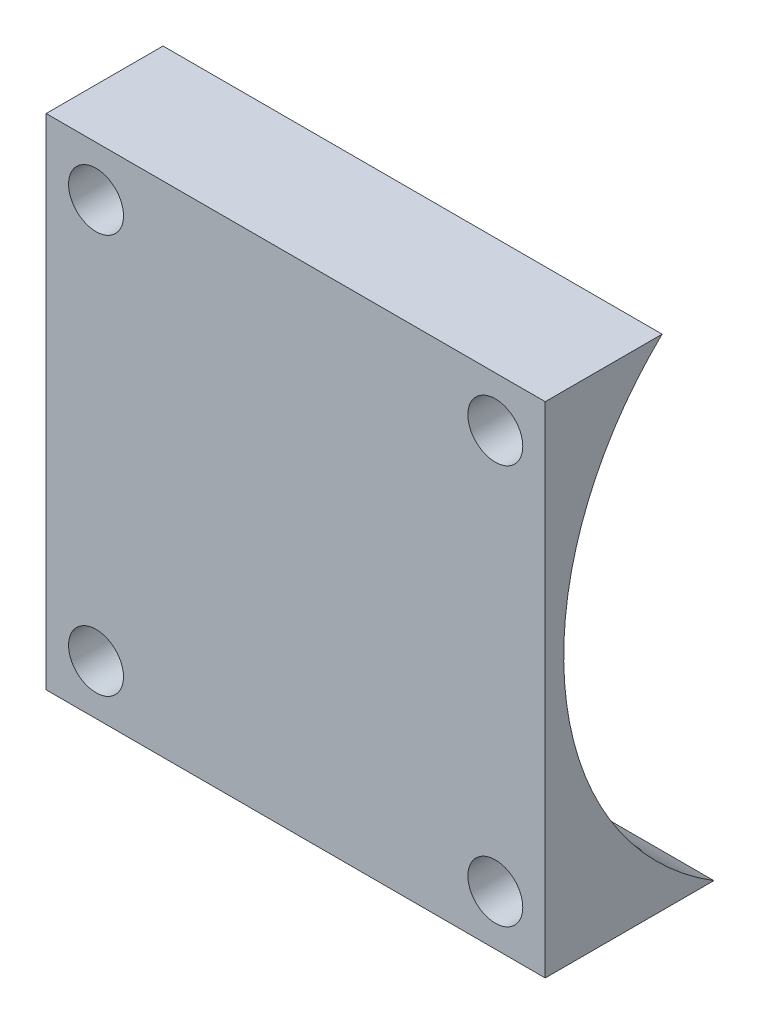
ISO-10303-21;
HEADER;
FILE_DESCRIPTION(('STEP AP214'),'2;1');
FILE_NAME('part.step','',(''),(''),'','','');
FILE_SCHEMA(('AUTOMOTIVE_DESIGN { 1 0 10303 214 1 1 1 1 }'));
ENDSEC;
DATA;
#1=APPLICATION_CONTEXT('core data for automotive mechanical design processes');
#2=APPLICATION_PROTOCOL_DEFINITION('international standard','automotive_design',2000,#1);
#3=PRODUCT_CONTEXT('',#1,'mechanical');
#4=PRODUCT('Part','Part','',(#3));
#5=PRODUCT_RELATED_PRODUCT_CATEGORY('part','',(#4));
#6=PRODUCT_DEFINITION_FORMATION('','',#4);
#7=PRODUCT_DEFINITION_CONTEXT('part definition',#1,'design');
#8=PRODUCT_DEFINITION('design','',#6,#7);
#9=PRODUCT_DEFINITION_SHAPE('','',#8);
#10=(LENGTH_UNIT() NAMED_UNIT(*) SI_UNIT(.MILLI.,.METRE.));
#11=(NAMED_UNIT(*) PLANE_ANGLE_UNIT() SI_UNIT($,.RADIAN.));
#12=(NAMED_UNIT(*) SI_UNIT($,.STERADIAN.) SOLID_ANGLE_UNIT());
#13=UNCERTAINTY_MEASURE_WITH_UNIT(LENGTH_MEASURE(1.E-05),#10,'distance_accuracy_value','');
#14=(GEOMETRIC_REPRESENTATION_CONTEXT(3) GLOBAL_UNCERTAINTY_ASSIGNED_CONTEXT((#13)) GLOBAL_UNIT_ASSIGNED_CONTEXT((#10,
#11,#12)) REPRESENTATION_CONTEXT('',''));
#15=CARTESIAN_POINT('',(0.,0.,0.));
#16=DIRECTION('',(0.,0.,1.));
#17=DIRECTION('',(1.,0.,0.));
#18=AXIS2_PLACEMENT_3D('',#15,#16,#17);
#19=CARTESIAN_POINT('',(0.,0.,33.6));
#20=DIRECTION('',(0.,0.,1.));
#21=DIRECTION('',(1.,0.,0.));
#22=AXIS2_PLACEMENT_3D('',#19,#20,#21);
#23=PLANE('',#22);
#24=CARTESIAN_POINT('',(20.,-22.,33.6));
#25=DIRECTION('',(0.,0.,1.));
#26=DIRECTION('',(1.,0.,0.));
#27=AXIS2_PLACEMENT_3D('',#24,#25,#26);
#28=CIRCLE('',#27,2.75);
#29=CARTESIAN_POINT('',(22.75,-22.,33.6));
#30=VERTEX_POINT('',#29);
#31=EDGE_CURVE('E141',#30,#30,#28,.T.);
#32=ORIENTED_EDGE('',*,*,#31,.F.);
#33=EDGE_LOOP('',(#32));
#34=FACE_BOUND('',#33,.T.);
#35=CARTESIAN_POINT('',(-20.,18.,33.6));
#36=DIRECTION('',(0.,0.,1.));
#37=DIRECTION('',(1.,0.,0.));
#38=AXIS2_PLACEMENT_3D('',#35,#36,#37);
#39=CIRCLE('',#38,2.75);
#40=CARTESIAN_POINT('',(-17.25,18.,33.6));
#41=VERTEX_POINT('',#40);
#42=EDGE_CURVE('E133',#41,#41,#39,.T.);
#43=ORIENTED_EDGE('',*,*,#42,.F.);
#44=EDGE_LOOP('',(#43));
#45=FACE_BOUND('',#44,.T.);
#46=DIRECTION('',(0.,1.,0.));
#47=VECTOR('',#46,1.);
#48=CARTESIAN_POINT('',(25.,23.,33.6));
#49=LINE('',#48,#47);
#50=CARTESIAN_POINT('',(25.,-27.,33.6));
#51=VERTEX_POINT('',#50);
#52=CARTESIAN_POINT('',(25.,23.,33.6));
#53=VERTEX_POINT('',#52);
#54=EDGE_CURVE('E130',#51,#53,#49,.T.);
#55=ORIENTED_EDGE('',*,*,#54,.T.);
#56=DIRECTION('',(-1.,0.,0.));
#57=VECTOR('',#56,1.);
#58=CARTESIAN_POINT('',(-25.,23.,33.6));
#59=LINE('',#58,#57);
#60=CARTESIAN_POINT('',(-25.,23.,33.6));
#61=VERTEX_POINT('',#60);
#62=EDGE_CURVE('E127',#53,#61,#59,.T.);
#63=ORIENTED_EDGE('',*,*,#62,.T.);
#64=DIRECTION('',(0.,-1.,0.));
#65=VECTOR('',#64,1.);
#66=CARTESIAN_POINT('',(-25.,23.,33.6));
#67=LINE('',#66,#65);
#68=CARTESIAN_POINT('',(-25.,-27.,33.6));
#69=VERTEX_POINT('',#68);
#70=EDGE_CURVE('E112',#61,#69,#67,.T.);
#71=ORIENTED_EDGE('',*,*,#70,.T.);
#72=DIRECTION('',(1.,0.,0.));
#73=VECTOR('',#72,1.);
#74=CARTESIAN_POINT('',(-25.,-27.,33.6));
#75=LINE('',#74,#73);
#76=EDGE_CURVE('E75',#69,#51,#75,.T.);
#77=ORIENTED_EDGE('',*,*,#76,.T.);
#78=EDGE_LOOP('',(#55,#63,#71,#77));
#79=FACE_BOUND('',#78,.T.);
#80=CARTESIAN_POINT('',(20.,18.,33.6));
#81=DIRECTION('',(0.,0.,1.));
#82=DIRECTION('',(1.,0.,0.));
#83=AXIS2_PLACEMENT_3D('',#80,#81,#82);
#84=CIRCLE('',#83,2.75);
#85=CARTESIAN_POINT('',(22.75,18.,33.6));
#86=VERTEX_POINT('',#85);
#87=EDGE_CURVE('E137',#86,#86,#84,.T.);
#88=ORIENTED_EDGE('',*,*,#87,.F.);
#89=EDGE_LOOP('',(#88));
#90=FACE_BOUND('',#89,.T.);
#91=CARTESIAN_POINT('',(-20.,-22.,33.6));
#92=DIRECTION('',(0.,0.,1.));
#93=DIRECTION('',(1.,0.,0.));
#94=AXIS2_PLACEMENT_3D('',#91,#92,#93);
#95=CIRCLE('',#94,2.75);
#96=CARTESIAN_POINT('',(-17.25,-22.,33.6));
#97=VERTEX_POINT('',#96);
#98=EDGE_CURVE('E109',#97,#97,#95,.T.);
#99=ORIENTED_EDGE('',*,*,#98,.F.);
#100=EDGE_LOOP('',(#99));
#101=FACE_BOUND('',#100,.T.);
#102=ADVANCED_FACE('F45',(#34,#45,#79,#90,#101),#23,.T.);
#103=CARTESIAN_POINT('',(25.,23.,33.6));
#104=DIRECTION('',(-1.,0.,0.));
#105=DIRECTION('',(0.,-1.,0.));
#106=AXIS2_PLACEMENT_3D('',#103,#104,#105);
#107=PLANE('',#106);
#108=DIRECTION('',(0.,0.,-1.));
#109=VECTOR('',#108,1.);
#110=CARTESIAN_POINT('',(25.,-27.,33.6));
#111=LINE('',#110,#109);
#112=CARTESIAN_POINT('',(25.,-27.,16.7051638722881));
#113=VERTEX_POINT('',#112);
#114=EDGE_CURVE('E117',#51,#113,#111,.T.);
#115=ORIENTED_EDGE('',*,*,#114,.T.);
#116=CARTESIAN_POINT('',(25.,0.,0.));
#117=DIRECTION('',(1.,0.,0.));
#118=DIRECTION('',(0.,0.,-1.));
#119=AXIS2_PLACEMENT_3D('',#116,#117,#118);
#120=CIRCLE('',#119,31.75);
#121=CARTESIAN_POINT('',(25.,23.,21.8874964306108));
#122=VERTEX_POINT('',#121);
#123=EDGE_CURVE('E67',#122,#113,#120,.T.);
#124=ORIENTED_EDGE('',*,*,#123,.F.);
#125=DIRECTION('',(0.,0.,-1.));
#126=VECTOR('',#125,1.);
#127=CARTESIAN_POINT('',(25.,23.,33.6));
#128=LINE('',#127,#126);
#129=EDGE_CURVE('E11',#53,#122,#128,.T.);
#130=ORIENTED_EDGE('',*,*,#129,.F.);
#131=ORIENTED_EDGE('',*,*,#54,.F.);
#132=EDGE_LOOP('',(#115,#124,#130,#131));
#133=FACE_BOUND('',#132,.T.);
#134=ADVANCED_FACE('F47',(#133),#107,.F.);
#135=CARTESIAN_POINT('',(-25.,23.,33.6));
#136=DIRECTION('',(0.,-1.,0.));
#137=DIRECTION('',(0.,0.,-1.));
#138=AXIS2_PLACEMENT_3D('',#135,#136,#137);
#139=PLANE('',#138);
#140=ORIENTED_EDGE('',*,*,#129,.T.);
#141=DIRECTION('',(1.,0.,0.));
#142=VECTOR('',#141,1.);
#143=CARTESIAN_POINT('',(-25.,23.,21.8874964306108));
#144=LINE('',#143,#142);
#145=CARTESIAN_POINT('',(-25.,23.,21.8874964306108));
#146=VERTEX_POINT('',#145);
#147=EDGE_CURVE('E95',#122,#146,#144,.F.);
#148=ORIENTED_EDGE('',*,*,#147,.T.);
#149=DIRECTION('',(0.,0.,-1.));
#150=VECTOR('',#149,1.);
#151=CARTESIAN_POINT('',(-25.,23.,33.6));
#152=LINE('',#151,#150);
#153=EDGE_CURVE('E60',#61,#146,#152,.T.);
#154=ORIENTED_EDGE('',*,*,#153,.F.);
#155=ORIENTED_EDGE('',*,*,#62,.F.);
#156=EDGE_LOOP('',(#140,#148,#154,#155));
#157=FACE_BOUND('',#156,.T.);
#158=ADVANCED_FACE('F105',(#157),#139,.F.);
#159=CARTESIAN_POINT('',(-25.,23.,33.6));
#160=DIRECTION('',(1.,0.,0.));
#161=DIRECTION('',(0.,1.,0.));
#162=AXIS2_PLACEMENT_3D('',#159,#160,#161);
#163=PLANE('',#162);
#164=ORIENTED_EDGE('',*,*,#153,.T.);
#165=CARTESIAN_POINT('',(-25.,0.,0.));
#166=DIRECTION('',(1.,0.,0.));
#167=DIRECTION('',(0.,0.,-1.));
#168=AXIS2_PLACEMENT_3D('',#165,#166,#167);
#169=CIRCLE('',#168,31.75);
#170=CARTESIAN_POINT('',(-25.,-27.,16.7051638722881));
#171=VERTEX_POINT('',#170);
#172=EDGE_CURVE('E92',#146,#171,#169,.T.);
#173=ORIENTED_EDGE('',*,*,#172,.T.);
#174=DIRECTION('',(0.,0.,-1.));
#175=VECTOR('',#174,1.);
#176=CARTESIAN_POINT('',(-25.,-27.,33.6));
#177=LINE('',#176,#175);
#178=EDGE_CURVE('E114',#69,#171,#177,.T.);
#179=ORIENTED_EDGE('',*,*,#178,.F.);
#180=ORIENTED_EDGE('',*,*,#70,.F.);
#181=EDGE_LOOP('',(#164,#173,#179,#180));
#182=FACE_BOUND('',#181,.T.);
#183=ADVANCED_FACE('F111',(#182),#163,.F.);
#184=CARTESIAN_POINT('',(-25.,-27.,33.6));
#185=DIRECTION('',(0.,1.,0.));
#186=DIRECTION('',(0.,0.,1.));
#187=AXIS2_PLACEMENT_3D('',#184,#185,#186);
#188=PLANE('',#187);
#189=ORIENTED_EDGE('',*,*,#178,.T.);
#190=DIRECTION('',(1.,0.,0.));
#191=VECTOR('',#190,1.);
#192=CARTESIAN_POINT('',(-25.,-27.,16.7051638722881));
#193=LINE('',#192,#191);
#194=EDGE_CURVE('E96',#171,#113,#193,.T.);
#195=ORIENTED_EDGE('',*,*,#194,.T.);
#196=ORIENTED_EDGE('',*,*,#114,.F.);
#197=ORIENTED_EDGE('',*,*,#76,.F.);
#198=EDGE_LOOP('',(#189,#195,#196,#197));
#199=FACE_BOUND('',#198,.T.);
#200=ADVANCED_FACE('F194',(#199),#188,.F.);
#201=CARTESIAN_POINT('',(-20.,18.,33.6));
#202=DIRECTION('',(0.,0.,-1.));
#203=DIRECTION('',(-1.,0.,0.));
#204=AXIS2_PLACEMENT_3D('',#201,#202,#203);
#205=CYLINDRICAL_SURFACE('',#204,2.75);
#206=CARTESIAN_POINT('',(-22.75,18.,26.154588507564));
#207=CARTESIAN_POINT('',(-22.7499997373205,17.8069148503228,26.287469673079));
#208=CARTESIAN_POINT('',(-22.7296874368397,17.6122405723125,26.4182677122373));
#209=CARTESIAN_POINT('',(-22.6463168365221,17.2264764267411,26.67140923248));
#210=CARTESIAN_POINT('',(-22.5832940842397,17.035383714085,26.7937596512121));
#211=CARTESIAN_POINT('',(-22.4339738947248,16.7108442706068,26.9969907697726));
#212=CARTESIAN_POINT('',(-22.3571758011968,16.5747539980788,27.0806826462759));
#213=CARTESIAN_POINT('',(-22.1782361975634,16.3139700409004,27.2385757361244));
#214=CARTESIAN_POINT('',(-22.0761093664543,16.1892698123469,27.3127824089022));
#215=CARTESIAN_POINT('',(-21.9044529985059,16.0144700167466,27.4153957773635));
#216=CARTESIAN_POINT('',(-21.8438661322868,15.9580368379813,27.4482688602771));
#217=CARTESIAN_POINT('',(-21.7168547968262,15.8501537106126,27.5107068765768));
#218=CARTESIAN_POINT('',(-21.6504333821253,15.7987011838156,27.5402735227567));
#219=CARTESIAN_POINT('',(-21.5121400173885,15.70150665498,27.5958027441408));
#220=CARTESIAN_POINT('',(-21.4402692592143,15.6557634099853,27.6217661039474));
#221=CARTESIAN_POINT('',(-21.2916376528087,15.5706965388501,27.6698082909529));
#222=CARTESIAN_POINT('',(-21.2148776329948,15.5313718291794,27.6918877738486));
#223=CARTESIAN_POINT('',(-20.9983468048999,15.4331812366644,27.7467938099606));
#224=CARTESIAN_POINT('',(-20.8541183437789,15.3814932914716,27.775423364787));
#225=CARTESIAN_POINT('',(-20.5572424382893,15.3026755653313,27.8189269028339));
#226=CARTESIAN_POINT('',(-20.4046013672974,15.2755274571761,27.8338111517091));
#227=CARTESIAN_POINT('',(-20.1115660961717,15.2487256074586,27.8485018580024));
#228=CARTESIAN_POINT('',(-19.9714608118856,15.2466094737016,27.8496587166722));
#229=CARTESIAN_POINT('',(-19.6929679132305,15.263637168995,27.8403300595625));
#230=CARTESIAN_POINT('',(-19.5545798962046,15.2827759152743,27.8298473272088));
#231=CARTESIAN_POINT('',(-19.287033576853,15.3405938638121,27.7980164224784));
#232=CARTESIAN_POINT('',(-19.1577299157958,15.3787624545352,27.7769520712846));
#233=CARTESIAN_POINT('',(-18.9078469376768,15.4726448161707,27.7247656449532));
#234=CARTESIAN_POINT('',(-18.7872685956195,15.5283605441633,27.6936424479149));
#235=CARTESIAN_POINT('',(-18.5524883293304,15.6577908179581,27.6206773158606));
#236=CARTESIAN_POINT('',(-18.4387831608611,15.7321759951195,27.578432204227));
#237=CARTESIAN_POINT('',(-18.2257428814223,15.8946542744885,27.485109337388));
#238=CARTESIAN_POINT('',(-18.1264124789831,15.9827518487399,27.4340287000327));
#239=CARTESIAN_POINT('',(-17.9343663602217,16.1789280061873,27.3188384033574));
#240=CARTESIAN_POINT('',(-17.8432637560279,16.2881197564996,27.2539412279334));
#241=CARTESIAN_POINT('',(-17.6806434414911,16.5158525136149,27.1165416035244));
#242=CARTESIAN_POINT('',(-17.6091351190238,16.6343979669897,27.0440355319449));
#243=CARTESIAN_POINT('',(-17.4772920999645,16.8943369397742,26.8825284953279));
#244=CARTESIAN_POINT('',(-17.4198398025272,17.036632689527,26.7926296405872));
#245=CARTESIAN_POINT('',(-17.3297994759114,17.3251633167137,26.6069675048143));
#246=CARTESIAN_POINT('',(-17.2972237499473,17.4714001063033,26.5112013472466));
#247=CARTESIAN_POINT('',(-17.2530402384896,17.786399712411,26.3010909644168));
#248=CARTESIAN_POINT('',(-17.2452754494824,17.9552753487725,26.1861032715539));
#249=CARTESIAN_POINT('',(-17.2601930729514,18.2899264098783,25.9534723849095));
#250=CARTESIAN_POINT('',(-17.2829023676621,18.4556989664357,25.8358269366757));
#251=CARTESIAN_POINT('',(-17.3620223478793,18.7986999716256,25.5875164624232));
#252=CARTESIAN_POINT('',(-17.4219087150947,18.9751445552841,25.4568624915302));
#253=CARTESIAN_POINT('',(-17.5775789922518,19.3150250506987,25.199952564292));
#254=CARTESIAN_POINT('',(-17.6733487679097,19.4784660538053,25.0736948976391));
#255=CARTESIAN_POINT('',(-17.8768834105602,19.754361910197,24.8566249938701));
#256=CARTESIAN_POINT('',(-17.977911448279,19.8703179946073,24.7639352994884));
#257=CARTESIAN_POINT('',(-18.2024491791801,20.0869986831103,24.5884997384969));
#258=CARTESIAN_POINT('',(-18.32592316315,20.1877470217366,24.5057384191243));
#259=CARTESIAN_POINT('',(-18.5661256656816,20.3500732480692,24.3710016665856));
#260=CARTESIAN_POINT('',(-18.678726145673,20.4154265610815,24.3162200705018));
#261=CARTESIAN_POINT('',(-18.9164739147988,20.530979945816,24.2187342838639));
#262=CARTESIAN_POINT('',(-19.0416147112645,20.5811878055506,24.1760238868387));
#263=CARTESIAN_POINT('',(-19.2372338217413,20.6430003978292,24.1232206879466));
#264=CARTESIAN_POINT('',(-19.304116452282,20.661412942239,24.107446033737));
#265=CARTESIAN_POINT('',(-19.4398865631947,20.6932552627204,24.080118935457));
#266=CARTESIAN_POINT('',(-19.508772952408,20.7066876979178,24.0685642381928));
#267=CARTESIAN_POINT('',(-19.647933573526,20.7282783663684,24.0499725979155));
#268=CARTESIAN_POINT('',(-19.7182069915897,20.7364396029491,24.0429330823405));
#269=CARTESIAN_POINT('',(-19.8594592315844,20.7473213490043,24.0335432578379));
#270=CARTESIAN_POINT('',(-19.930437942861,20.7500426988162,24.031192224648));
#271=CARTESIAN_POINT('',(-20.1230623742995,20.7499258389704,24.0312947234933));
#272=CARTESIAN_POINT('',(-20.2447740904965,20.7417446597309,24.0383652610293));
#273=CARTESIAN_POINT('',(-20.4844416265098,20.7096995930685,24.0659772608729));
#274=CARTESIAN_POINT('',(-20.6023973199745,20.6858351786485,24.0865191758535));
#275=CARTESIAN_POINT('',(-20.8299207211664,20.6243878020863,24.1391532228481));
#276=CARTESIAN_POINT('',(-20.9395877576208,20.587016133462,24.1710673567769));
#277=CARTESIAN_POINT('',(-21.1505723192177,20.5003437788363,24.2446207560624));
#278=CARTESIAN_POINT('',(-21.2518859840751,20.4510376185966,24.2862644839862));
#279=CARTESIAN_POINT('',(-21.4854505557798,20.3196142157486,24.3964304309781));
#280=CARTESIAN_POINT('',(-21.6129715806534,20.2323906288629,24.4689176312874));
#281=CARTESIAN_POINT('',(-21.8479751360611,20.0421676153006,24.6249715860698));
#282=CARTESIAN_POINT('',(-21.9554138263528,19.9391345480825,24.708561914382));
#283=CARTESIAN_POINT('',(-22.1744811115617,19.6934012751613,24.9050782982042));
#284=CARTESIAN_POINT('',(-22.2803565525029,19.5472445870831,25.0200921604817));
#285=CARTESIAN_POINT('',(-22.4603623307581,19.241228918347,25.2561877649173));
#286=CARTESIAN_POINT('',(-22.5344929621954,19.0813700646594,25.377269450844));
#287=CARTESIAN_POINT('',(-22.6446606857637,18.7697711307797,25.6084303792102));
#288=CARTESIAN_POINT('',(-22.6839340538075,18.6190031565395,25.7182945622249));
#289=CARTESIAN_POINT('',(-22.7366091091878,18.3125073499372,25.937426628521));
#290=CARTESIAN_POINT('',(-22.7500002132854,18.1567775151189,26.0466942496661));
#291=CARTESIAN_POINT('',(-22.75,18.,26.154588507564));
#292=B_SPLINE_CURVE_WITH_KNOTS('',3,(#206,#207,#208,#209,#210,#211,#212,#213,#214,#215,#216,
#217,#218,#219,#220,#221,#222,#223,#224,#225,#226,#227,#228,#229,#230,#231,#232,#233,#234,#235,
#236,#237,#238,#239,#240,#241,#242,#243,#244,#245,#246,#247,#248,#249,#250,#251,#252,#253,#254,
#255,#256,#257,#258,#259,#260,#261,#262,#263,#264,#265,#266,#267,#268,#269,#270,#271,#272,#273,
#274,#275,#276,#277,#278,#279,#280,#281,#282,#283,#284,#285,#286,#287,#288,#289,#290,#291),
.UNSPECIFIED.,.T.,.F.,(4,2,2,2,2,2,2,2,2,2,2,2,2,2,2,2,2,2,2,2,2,2,2,2,2,2,2,2,2,2,2,2,2,2,2,2,
2,2,2,2,2,2,4),(0.,0.702438392437467,1.40429286806628,1.93401025066524,2.46342135571447,
2.73035172607751,2.99714317484111,3.26387643929194,3.53056462910121,3.99531889736188,
4.45972578343136,4.87801926682106,5.29621274341949,5.70374463171279,6.11132198926034,
6.53641593376822,6.96164880639232,7.42873197921874,7.89603854793691,8.4275098909983,
8.95924391409712,9.57012932532635,10.181553973926,10.8611589671571,11.5404965485343,
12.077245936589,12.6131487674624,13.0353384633029,13.4573106915263,13.6704616084588,
13.8834985491371,14.0964140021867,14.3092965621593,14.6738641091113,15.038443907098,
15.3975513253998,15.7568237760661,16.2660025501781,16.7762802139605,17.4150070523322,
18.05372797262,18.6238471305478,19.1941993605072),.UNSPECIFIED.);
#293=CARTESIAN_POINT('',(-22.75,18.,26.154588507564));
#294=VERTEX_POINT('',#293);
#295=EDGE_CURVE('E150',#294,#294,#292,.T.);
#296=ORIENTED_EDGE('',*,*,#295,.F.);
#297=EDGE_LOOP('',(#296));
#298=FACE_BOUND('',#297,.T.);
#299=ORIENTED_EDGE('',*,*,#42,.T.);
#300=EDGE_LOOP('',(#299));
#301=FACE_BOUND('',#300,.T.);
#302=ADVANCED_FACE('F164',(#298,#301),#205,.F.);
#303=CARTESIAN_POINT('',(20.,18.,33.6));
#304=DIRECTION('',(0.,0.,-1.));
#305=DIRECTION('',(-1.,0.,0.));
#306=AXIS2_PLACEMENT_3D('',#303,#304,#305);
#307=CYLINDRICAL_SURFACE('',#306,2.75);
#308=CARTESIAN_POINT('',(17.25,18.,26.154588507564));
#309=CARTESIAN_POINT('',(17.2500002626795,17.8069148503228,26.287469673079));
#310=CARTESIAN_POINT('',(17.2703125631603,17.6122405723125,26.4182677122373));
#311=CARTESIAN_POINT('',(17.3536831634779,17.2264764267411,26.67140923248));
#312=CARTESIAN_POINT('',(17.4167059157604,17.035383714085,26.7937596512121));
#313=CARTESIAN_POINT('',(17.5660261052752,16.7108442706068,26.9969907697726));
#314=CARTESIAN_POINT('',(17.6428241988032,16.5747539980788,27.0806826462759));
#315=CARTESIAN_POINT('',(17.8217638024366,16.3139700409004,27.2385757361244));
#316=CARTESIAN_POINT('',(17.9238906335457,16.1892698123469,27.3127824089022));
#317=CARTESIAN_POINT('',(18.0955470014941,16.0144700167466,27.4153957773635));
#318=CARTESIAN_POINT('',(18.1561338677133,15.9580368379813,27.4482688602771));
#319=CARTESIAN_POINT('',(18.2831452031738,15.8501537106126,27.5107068765768));
#320=CARTESIAN_POINT('',(18.3495666178747,15.7987011838156,27.5402735227567));
#321=CARTESIAN_POINT('',(18.4878599826115,15.70150665498,27.5958027441408));
#322=CARTESIAN_POINT('',(18.5597307407857,15.6557634099853,27.6217661039474));
#323=CARTESIAN_POINT('',(18.7083623471913,15.5706965388501,27.6698082909529));
#324=CARTESIAN_POINT('',(18.7851223670052,15.5313718291794,27.6918877738486));
#325=CARTESIAN_POINT('',(19.0016531951001,15.4331812366644,27.7467938099606));
#326=CARTESIAN_POINT('',(19.1458816562211,15.3814932914716,27.775423364787));
#327=CARTESIAN_POINT('',(19.4427575617107,15.3026755653313,27.8189269028339));
#328=CARTESIAN_POINT('',(19.5953986327026,15.2755274571761,27.8338111517091));
#329=CARTESIAN_POINT('',(19.8884339038283,15.2487256074586,27.8485018580024));
#330=CARTESIAN_POINT('',(20.0285391881144,15.2466094737016,27.8496587166722));
#331=CARTESIAN_POINT('',(20.3070320867695,15.263637168995,27.8403300595626));
#332=CARTESIAN_POINT('',(20.4454201037954,15.2827759152743,27.8298473272088));
#333=CARTESIAN_POINT('',(20.712966423147,15.3405938638121,27.7980164224784));
#334=CARTESIAN_POINT('',(20.8422700842043,15.3787624545352,27.7769520712846));
#335=CARTESIAN_POINT('',(21.0921530623232,15.4726448161707,27.7247656449532));
#336=CARTESIAN_POINT('',(21.2127314043805,15.5283605441633,27.6936424479149));
#337=CARTESIAN_POINT('',(21.4475116706696,15.6577908179581,27.6206773158606));
#338=CARTESIAN_POINT('',(21.5612168391389,15.7321759951195,27.578432204227));
#339=CARTESIAN_POINT('',(21.7742571185777,15.8946542744885,27.485109337388));
#340=CARTESIAN_POINT('',(21.8735875210169,15.9827518487399,27.4340287000327));
#341=CARTESIAN_POINT('',(22.0656336397783,16.1789280061873,27.3188384033574));
#342=CARTESIAN_POINT('',(22.1567362439721,16.2881197564996,27.2539412279334));
#343=CARTESIAN_POINT('',(22.3193565585089,16.5158525136149,27.1165416035244));
#344=CARTESIAN_POINT('',(22.3908648809762,16.6343979669897,27.0440355319449));
#345=CARTESIAN_POINT('',(22.5227079000356,16.8943369397742,26.8825284953279));
#346=CARTESIAN_POINT('',(22.5801601974728,17.036632689527,26.7926296405872));
#347=CARTESIAN_POINT('',(22.6702005240886,17.3251633167137,26.6069675048143));
#348=CARTESIAN_POINT('',(22.7027762500527,17.4714001063033,26.5112013472466));
#349=CARTESIAN_POINT('',(22.7469597615104,17.786399712411,26.3010909644168));
#350=CARTESIAN_POINT('',(22.7547245505176,17.9552753487725,26.1861032715539));
#351=CARTESIAN_POINT('',(22.7398069270486,18.2899264098783,25.9534723849095));
#352=CARTESIAN_POINT('',(22.7170976323379,18.4556989664357,25.8358269366757));
#353=CARTESIAN_POINT('',(22.6379776521207,18.7986999716256,25.5875164624232));
#354=CARTESIAN_POINT('',(22.5780912849053,18.9751445552841,25.4568624915302));
#355=CARTESIAN_POINT('',(22.4224210077482,19.3150250506987,25.199952564292));
#356=CARTESIAN_POINT('',(22.3266512320903,19.4784660538053,25.0736948976391));
#357=CARTESIAN_POINT('',(22.1231165894398,19.754361910197,24.8566249938701));
#358=CARTESIAN_POINT('',(22.022088551721,19.8703179946073,24.7639352994884));
#359=CARTESIAN_POINT('',(21.7975508208199,20.0869986831103,24.5884997384969));
#360=CARTESIAN_POINT('',(21.67407683685,20.1877470217366,24.5057384191243));
#361=CARTESIAN_POINT('',(21.4338743343184,20.3500732480692,24.3710016665857));
#362=CARTESIAN_POINT('',(21.321273854327,20.4154265610815,24.3162200705018));
#363=CARTESIAN_POINT('',(21.0835260852012,20.530979945816,24.2187342838639));
#364=CARTESIAN_POINT('',(20.9583852887355,20.5811878055506,24.1760238868387));
#365=CARTESIAN_POINT('',(20.7627661782587,20.6430003978292,24.1232206879466));
#366=CARTESIAN_POINT('',(20.695883547718,20.661412942239,24.107446033737));
#367=CARTESIAN_POINT('',(20.5601134368053,20.6932552627204,24.080118935457));
#368=CARTESIAN_POINT('',(20.491227047592,20.7066876979178,24.0685642381928));
#369=CARTESIAN_POINT('',(20.352066426474,20.7282783663684,24.0499725979155));
#370=CARTESIAN_POINT('',(20.2817930084103,20.7364396029491,24.0429330823405));
#371=CARTESIAN_POINT('',(20.1405407684156,20.7473213490043,24.0335432578379));
#372=CARTESIAN_POINT('',(20.069562057139,20.7500426988162,24.031192224648));
#373=CARTESIAN_POINT('',(19.8769376257005,20.7499258389704,24.0312947234933));
#374=CARTESIAN_POINT('',(19.7552259095036,20.7417446597309,24.0383652610293));
#375=CARTESIAN_POINT('',(19.5155583734902,20.7096995930685,24.0659772608729));
#376=CARTESIAN_POINT('',(19.3976026800255,20.6858351786485,24.0865191758535));
#377=CARTESIAN_POINT('',(19.1700792788336,20.6243878020863,24.1391532228481));
#378=CARTESIAN_POINT('',(19.0604122423793,20.587016133462,24.1710673567769));
#379=CARTESIAN_POINT('',(18.8494276807823,20.5003437788363,24.2446207560624));
#380=CARTESIAN_POINT('',(18.7481140159249,20.4510376185966,24.2862644839862));
#381=CARTESIAN_POINT('',(18.5145494442202,20.3196142157486,24.3964304309781));
#382=CARTESIAN_POINT('',(18.3870284193466,20.2323906288629,24.4689176312874));
#383=CARTESIAN_POINT('',(18.1520248639389,20.0421676153006,24.6249715860698));
#384=CARTESIAN_POINT('',(18.0445861736472,19.9391345480825,24.708561914382));
#385=CARTESIAN_POINT('',(17.8255188884383,19.6934012751613,24.9050782982042));
#386=CARTESIAN_POINT('',(17.7196434474971,19.5472445870831,25.0200921604817));
#387=CARTESIAN_POINT('',(17.5396376692419,19.241228918347,25.2561877649173));
#388=CARTESIAN_POINT('',(17.4655070378047,19.0813700646594,25.377269450844));
#389=CARTESIAN_POINT('',(17.3553393142363,18.7697711307797,25.6084303792102));
#390=CARTESIAN_POINT('',(17.3160659461925,18.6190031565395,25.7182945622249));
#391=CARTESIAN_POINT('',(17.2633908908122,18.3125073499372,25.937426628521));
#392=CARTESIAN_POINT('',(17.2499997867146,18.1567775151189,26.0466942496661));
#393=CARTESIAN_POINT('',(17.25,18.,26.154588507564));
#394=B_SPLINE_CURVE_WITH_KNOTS('',3,(#308,#309,#310,#311,#312,#313,#314,#315,#316,#317,#318,
#319,#320,#321,#322,#323,#324,#325,#326,#327,#328,#329,#330,#331,#332,#333,#334,#335,#336,#337,
#338,#339,#340,#341,#342,#343,#344,#345,#346,#347,#348,#349,#350,#351,#352,#353,#354,#355,#356,
#357,#358,#359,#360,#361,#362,#363,#364,#365,#366,#367,#368,#369,#370,#371,#372,#373,#374,#375,
#376,#377,#378,#379,#380,#381,#382,#383,#384,#385,#386,#387,#388,#389,#390,#391,#392,#393),
.UNSPECIFIED.,.T.,.F.,(4,2,2,2,2,2,2,2,2,2,2,2,2,2,2,2,2,2,2,2,2,2,2,2,2,2,2,2,2,2,2,2,2,2,2,2,
2,2,2,2,2,2,4),(0.,0.702438392437467,1.40429286806628,1.93401025066524,2.46342135571447,
2.73035172607751,2.99714317484111,3.26387643929194,3.53056462910121,3.99531889736188,
4.45972578343136,4.87801926682105,5.29621274341949,5.70374463171279,6.11132198926034,
6.53641593376822,6.96164880639232,7.42873197921874,7.89603854793691,8.4275098909983,
8.95924391409712,9.57012932532635,10.181553973926,10.8611589671571,11.5404965485343,
12.077245936589,12.6131487674624,13.0353384633029,13.4573106915263,13.6704616084588,
13.8834985491371,14.0964140021867,14.3092965621593,14.6738641091113,15.038443907098,
15.3975513253998,15.7568237760661,16.2660025501781,16.7762802139605,17.4150070523322,
18.05372797262,18.6238471305479,19.1941993605072),.UNSPECIFIED.);
#395=CARTESIAN_POINT('',(17.25,18.,26.154588507564));
#396=VERTEX_POINT('',#395);
#397=EDGE_CURVE('E158',#396,#396,#394,.T.);
#398=ORIENTED_EDGE('',*,*,#397,.F.);
#399=EDGE_LOOP('',(#398));
#400=FACE_BOUND('',#399,.T.);
#401=ORIENTED_EDGE('',*,*,#87,.T.);
#402=EDGE_LOOP('',(#401));
#403=FACE_BOUND('',#402,.T.);
#404=ADVANCED_FACE('F186',(#400,#403),#307,.F.);
#405=CARTESIAN_POINT('',(20.,-22.,33.6));
#406=DIRECTION('',(0.,0.,-1.));
#407=DIRECTION('',(-1.,0.,0.));
#408=AXIS2_PLACEMENT_3D('',#405,#406,#407);
#409=CYLINDRICAL_SURFACE('',#408,2.75);
#410=CARTESIAN_POINT('',(17.25,-22.,22.8924114064028));
#411=CARTESIAN_POINT('',(17.2499947440091,-22.2176423467406,22.6832407340936));
#412=CARTESIAN_POINT('',(17.2757823960024,-22.4327070055996,22.4705190786284));
#413=CARTESIAN_POINT('',(17.3510215377248,-22.746353201751,22.1514920358131));
#414=CARTESIAN_POINT('',(17.3823000962769,-22.8496204958995,22.0449319975264));
#415=CARTESIAN_POINT('',(17.4571031955379,-23.052547116546,21.8326364011066));
#416=CARTESIAN_POINT('',(17.5006226366052,-23.1522079260589,21.7269005184366));
#417=CARTESIAN_POINT('',(17.5892889425574,-23.3260159123746,21.5400112208898));
#418=CARTESIAN_POINT('',(17.6320383618137,-23.401010932771,21.4584972260251));
#419=CARTESIAN_POINT('',(17.7253498884365,-23.5479136410594,21.2971863887598));
#420=CARTESIAN_POINT('',(17.7759102273749,-23.6198220230831,21.2173891623223));
#421=CARTESIAN_POINT('',(17.8850324435899,-23.7599089612041,21.0603956888715));
#422=CARTESIAN_POINT('',(17.9435762763661,-23.8280954563478,20.9831940522445));
#423=CARTESIAN_POINT('',(18.0691236877131,-23.9602337833634,20.8321809726882));
#424=CARTESIAN_POINT('',(18.1361232499626,-24.0241876038394,20.7583679427824));
#425=CARTESIAN_POINT('',(18.2992956319498,-24.1644253175125,20.5950874543536));
#426=CARTESIAN_POINT('',(18.3983658308598,-24.2390965554489,20.5070795913477));
#427=CARTESIAN_POINT('',(18.6122614857459,-24.3775744396471,20.3422692580592));
#428=CARTESIAN_POINT('',(18.7270656082166,-24.4413955393846,20.2654519007453));
#429=CARTESIAN_POINT('',(18.9441665249125,-24.5413570502583,20.1442047909011));
#430=CARTESIAN_POINT('',(19.0431797457205,-24.580483985884,20.0963962167253));
#431=CARTESIAN_POINT('',(19.2500071343281,-24.6479755472679,20.0135622972829));
#432=CARTESIAN_POINT('',(19.3578135348316,-24.6763495489615,19.9785258165109));
#433=CARTESIAN_POINT('',(19.5249017542183,-24.7092571172431,19.9377886532808));
#434=CARTESIAN_POINT('',(19.5818442850842,-24.7186434515452,19.9261464119649));
#435=CARTESIAN_POINT('',(19.6969092027729,-24.7338608792253,19.9072543393892));
#436=CARTESIAN_POINT('',(19.7550309344523,-24.739693893742,19.9000021346246));
#437=CARTESIAN_POINT('',(19.8718920362913,-24.7476382022759,19.8901217910069));
#438=CARTESIAN_POINT('',(19.9306310677382,-24.7497514400051,19.8874912371827));
#439=CARTESIAN_POINT('',(20.0481261170973,-24.75020753631,19.8869234203453));
#440=CARTESIAN_POINT('',(20.1068821319035,-24.7485508738296,19.8889855611523));
#441=CARTESIAN_POINT('',(20.2640695947665,-24.7390703652282,19.9007791941472));
#442=CARTESIAN_POINT('',(20.362017063859,-24.7277906114904,19.9148074397051));
#443=CARTESIAN_POINT('',(20.5536558000712,-24.6954504166986,19.9548959232706));
#444=CARTESIAN_POINT('',(20.6473448615413,-24.6743849691005,19.9809623201817));
#445=CARTESIAN_POINT('',(20.8583032532937,-24.6156007595021,20.0533662490404));
#446=CARTESIAN_POINT('',(20.9733649594072,-24.5746966800892,20.1035364192297));
#447=CARTESIAN_POINT('',(21.1915695513828,-24.4812956896712,20.2171730572775));
#448=CARTESIAN_POINT('',(21.2946876612125,-24.4287753153821,20.2806664226164));
#449=CARTESIAN_POINT('',(21.5338406721921,-24.288443405863,20.4487358525316));
#450=CARTESIAN_POINT('',(21.663042799085,-24.1955439709968,20.5587312689082));
#451=CARTESIAN_POINT('',(21.897727277677,-23.9962237562302,20.7910392725613));
#452=CARTESIAN_POINT('',(22.0031587783874,-23.8897747370557,20.9133774702484));
#453=CARTESIAN_POINT('',(22.1656464503912,-23.6980886753129,21.1300218040316));
#454=CARTESIAN_POINT('',(22.2279812810588,-23.615260053113,21.2225833144664));
#455=CARTESIAN_POINT('',(22.3418826209094,-23.445188267738,21.41031717134));
#456=CARTESIAN_POINT('',(22.3934446396906,-23.3579432824507,21.5054905878664));
#457=CARTESIAN_POINT('',(22.4861453300236,-23.1796937539377,21.6974993444274));
#458=CARTESIAN_POINT('',(22.5272763152216,-23.0886864954893,21.794335854175));
#459=CARTESIAN_POINT('',(22.599222594848,-22.9035506704377,21.9888129644251));
#460=CARTESIAN_POINT('',(22.6300392760254,-22.8094225253067,22.086453455023));
#461=CARTESIAN_POINT('',(22.681899804859,-22.6165183616488,22.2839635127546));
#462=CARTESIAN_POINT('',(22.7027230634091,-22.5176861397087,22.3838365294059));
#463=CARTESIAN_POINT('',(22.7334417475657,-22.3178449211992,22.5830974838157));
#464=CARTESIAN_POINT('',(22.7433328406023,-22.2168350777645,22.6824852137243));
#465=CARTESIAN_POINT('',(22.7561056535532,-21.9116135955965,22.978762475084));
#466=CARTESIAN_POINT('',(22.742189793309,-21.7048314749646,23.174154076334));
#467=CARTESIAN_POINT('',(22.6727082728201,-21.3305573856332,23.5185437324009));
#468=CARTESIAN_POINT('',(22.6255732257535,-21.1630775200953,23.6692941293507));
#469=CARTESIAN_POINT('',(22.4962455964235,-20.8326839296345,23.9605916675407));
#470=CARTESIAN_POINT('',(22.4140975965882,-20.6697646778032,24.1011515191176));
#471=CARTESIAN_POINT('',(22.2348055973732,-20.3909375661932,24.3371679635299));
#472=CARTESIAN_POINT('',(22.1452356878889,-20.272720885129,24.4356424705071));
#473=CARTESIAN_POINT('',(21.9425447684829,-20.0475982685107,24.6206707174016));
#474=CARTESIAN_POINT('',(21.8294536271123,-19.9406782450307,24.7072393466566));
#475=CARTESIAN_POINT('',(21.6028408034261,-19.7616270564297,24.8505798918957));
#476=CARTESIAN_POINT('',(21.4931433141616,-19.6867059184499,24.9099073185107));
#477=CARTESIAN_POINT('',(21.2593407563273,-19.5515893979757,25.0160997384572));
#478=CARTESIAN_POINT('',(21.1352408015722,-19.4913888121708,25.0629691358709));
#479=CARTESIAN_POINT('',(20.9399736284535,-19.4146720298193,25.122381825925));
#480=CARTESIAN_POINT('',(20.8730705522164,-19.3912959892837,25.1404222894269));
#481=CARTESIAN_POINT('',(20.7367995498725,-19.3495863789711,25.1725385987143));
#482=CARTESIAN_POINT('',(20.6674328626946,-19.3312503140694,25.1866164063625));
#483=CARTESIAN_POINT('',(20.5268035693488,-19.2999696247305,25.2105942906384));
#484=CARTESIAN_POINT('',(20.4555415224897,-19.2870234281507,25.2204955855024));
#485=CARTESIAN_POINT('',(20.3117835621193,-19.2667657595481,25.2359741609507));
#486=CARTESIAN_POINT('',(20.2392878116853,-19.2594535486191,25.2415520085627));
#487=CARTESIAN_POINT('',(20.0386418963449,-19.2473010971187,25.2508227874194));
#488=CARTESIAN_POINT('',(19.909827354543,-19.2485029464487,25.2499072902048));
#489=CARTESIAN_POINT('',(19.6545530735558,-19.268775505299,25.2344394005525));
#490=CARTESIAN_POINT('',(19.5280928071602,-19.2878421639122,25.2198900996265));
#491=CARTESIAN_POINT('',(19.2853629298921,-19.3416707593042,25.1786290670791));
#492=CARTESIAN_POINT('',(19.1688923316093,-19.3758693344458,25.152353622294));
#493=CARTESIAN_POINT('',(18.9440914486602,-19.457974474257,25.0888901428022));
#494=CARTESIAN_POINT('',(18.835762612683,-19.5058834712079,25.0517001717868));
#495=CARTESIAN_POINT('',(18.620703213495,-19.617588854992,24.9643366478787));
#496=CARTESIAN_POINT('',(18.5148078115933,-19.6823556421725,24.9133572668287));
#497=CARTESIAN_POINT('',(18.3159151180089,-19.8225711789431,24.8019397441245));
#498=CARTESIAN_POINT('',(18.2229248647372,-19.8980257126078,24.7414964788552));
#499=CARTESIAN_POINT('',(18.0126928361424,-20.0917341653897,24.5846730570741));
#500=CARTESIAN_POINT('',(17.9025317966688,-20.2143141805519,24.4841077536518));
#501=CARTESIAN_POINT('',(17.7093056216449,-20.4699612194513,24.2707867279913));
#502=CARTESIAN_POINT('',(17.6263073634644,-20.6030531401677,24.1580018143409));
#503=CARTESIAN_POINT('',(17.4651370455862,-20.9153813031102,23.8885629392717));
#504=CARTESIAN_POINT('',(17.3958045278181,-21.0965306359934,23.7288650061593));
#505=CARTESIAN_POINT('',(17.2968586221185,-21.4604948025632,23.4002086720491));
#506=CARTESIAN_POINT('',(17.2671921892942,-21.6433070821583,23.2312629535376));
#507=CARTESIAN_POINT('',(17.2518559020824,-21.8831416767037,23.0042879443111));
#508=CARTESIAN_POINT('',(17.2500014088088,-21.9416634349945,22.9484772350669));
#509=CARTESIAN_POINT('',(17.25,-22.,22.8924114064028));
#510=B_SPLINE_CURVE_WITH_KNOTS('',3,(#410,#411,#412,#413,#414,#415,#416,#417,#418,#419,#420,
#421,#422,#423,#424,#425,#426,#427,#428,#429,#430,#431,#432,#433,#434,#435,#436,#437,#438,#439,
#440,#441,#442,#443,#444,#445,#446,#447,#448,#449,#450,#451,#452,#453,#454,#455,#456,#457,#458,
#459,#460,#461,#462,#463,#464,#465,#466,#467,#468,#469,#470,#471,#472,#473,#474,#475,#476,#477,
#478,#479,#480,#481,#482,#483,#484,#485,#486,#487,#488,#489,#490,#491,#492,#493,#494,#495,#496,
#497,#498,#499,#500,#501,#502,#503,#504,#505,#506,#507,#508,#509),.UNSPECIFIED.,.T.,.F.,(4,2,2,
2,2,2,2,2,2,2,2,2,2,2,2,2,2,2,2,2,2,2,2,2,2,2,2,2,2,2,2,2,2,2,2,2,2,2,2,2,2,2,2,2,2,2,2,2,2,4),
(0.,0.905311620579077,1.3599083315394,1.81431593396754,2.17022772409558,2.52605905193119,
2.88109905419985,3.23597104901252,3.69097480316906,4.14536761486984,4.49427380772627,
4.84287507077037,5.01925655824034,5.19554259842682,5.37173649568692,5.54790800978265,
5.8451521814947,6.14254859666032,6.53640171143196,6.93105773966324,7.50823701328152,
8.08663953543547,8.50305665952543,8.91964701285772,9.33654345449552,9.75338382223916,
10.1790444537186,10.6048737200267,11.4548946412738,12.1431437978132,12.8305192039912,
13.3626901935494,13.8941894846291,14.3289584139002,14.7635734414335,14.9826924882213,
15.2017028602587,15.4206493054714,15.6395670306167,16.0238908707869,16.408127585288,
16.7791266458935,17.1501915639948,17.5512148400417,17.9524559800147,18.5284780701117,
19.1059078951165,19.8557386432815,20.6045656471624,20.8472241692518),.UNSPECIFIED.);
#511=CARTESIAN_POINT('',(17.25,-22.,22.8924114064028));
#512=VERTEX_POINT('',#511);
#513=EDGE_CURVE('E176',#512,#512,#510,.T.);
#514=ORIENTED_EDGE('',*,*,#513,.F.);
#515=EDGE_LOOP('',(#514));
#516=FACE_BOUND('',#515,.T.);
#517=ORIENTED_EDGE('',*,*,#31,.T.);
#518=EDGE_LOOP('',(#517));
#519=FACE_BOUND('',#518,.T.);
#520=ADVANCED_FACE('F183',(#516,#519),#409,.F.);
#521=CARTESIAN_POINT('',(-20.,-22.,33.6));
#522=DIRECTION('',(0.,0.,-1.));
#523=DIRECTION('',(-1.,0.,0.));
#524=AXIS2_PLACEMENT_3D('',#521,#522,#523);
#525=CYLINDRICAL_SURFACE('',#524,2.75);
#526=CARTESIAN_POINT('',(-22.75,-22.,22.8924114064028));
#527=CARTESIAN_POINT('',(-22.7500052559909,-22.2176423467406,22.6832407340936));
#528=CARTESIAN_POINT('',(-22.7242176039976,-22.4327070055996,22.4705190786284));
#529=CARTESIAN_POINT('',(-22.6489784622752,-22.746353201751,22.1514920358131));
#530=CARTESIAN_POINT('',(-22.6176999037231,-22.8496204958995,22.0449319975264));
#531=CARTESIAN_POINT('',(-22.5428968044621,-23.052547116546,21.8326364011066));
#532=CARTESIAN_POINT('',(-22.4993773633948,-23.1522079260589,21.7269005184366));
#533=CARTESIAN_POINT('',(-22.4107110574425,-23.3260159123746,21.5400112208898));
#534=CARTESIAN_POINT('',(-22.3679616381863,-23.401010932771,21.4584972260251));
#535=CARTESIAN_POINT('',(-22.2746501115635,-23.5479136410594,21.2971863887598));
#536=CARTESIAN_POINT('',(-22.2240897726251,-23.6198220230831,21.2173891623223));
#537=CARTESIAN_POINT('',(-22.1149675564101,-23.7599089612041,21.0603956888715));
#538=CARTESIAN_POINT('',(-22.0564237236339,-23.8280954563478,20.9831940522445));
#539=CARTESIAN_POINT('',(-21.9308763122869,-23.9602337833634,20.8321809726881));
#540=CARTESIAN_POINT('',(-21.8638767500374,-24.0241876038394,20.7583679427824));
#541=CARTESIAN_POINT('',(-21.7007043680502,-24.1644253175125,20.5950874543536));
#542=CARTESIAN_POINT('',(-21.6016341691402,-24.2390965554489,20.5070795913477));
#543=CARTESIAN_POINT('',(-21.3877385142541,-24.3775744396471,20.3422692580592));
#544=CARTESIAN_POINT('',(-21.2729343917834,-24.4413955393846,20.2654519007453));
#545=CARTESIAN_POINT('',(-21.0558334750875,-24.5413570502583,20.1442047909011));
#546=CARTESIAN_POINT('',(-20.9568202542795,-24.580483985884,20.0963962167253));
#547=CARTESIAN_POINT('',(-20.7499928656719,-24.6479755472679,20.0135622972829));
#548=CARTESIAN_POINT('',(-20.6421864651684,-24.6763495489615,19.9785258165109));
#549=CARTESIAN_POINT('',(-20.4750982457817,-24.7092571172431,19.9377886532808));
#550=CARTESIAN_POINT('',(-20.4181557149158,-24.7186434515452,19.9261464119649));
#551=CARTESIAN_POINT('',(-20.3030907972271,-24.7338608792253,19.9072543393892));
#552=CARTESIAN_POINT('',(-20.2449690655477,-24.739693893742,19.9000021346246));
#553=CARTESIAN_POINT('',(-20.1281079637087,-24.7476382022759,19.8901217910069));
#554=CARTESIAN_POINT('',(-20.0693689322618,-24.7497514400051,19.8874912371827));
#555=CARTESIAN_POINT('',(-19.9518738829027,-24.75020753631,19.8869234203453));
#556=CARTESIAN_POINT('',(-19.8931178680965,-24.7485508738296,19.8889855611523));
#557=CARTESIAN_POINT('',(-19.7359304052335,-24.7390703652282,19.9007791941472));
#558=CARTESIAN_POINT('',(-19.637982936141,-24.7277906114904,19.9148074397051));
#559=CARTESIAN_POINT('',(-19.4463441999288,-24.6954504166986,19.9548959232706));
#560=CARTESIAN_POINT('',(-19.3526551384587,-24.6743849691005,19.9809623201817));
#561=CARTESIAN_POINT('',(-19.1416967467063,-24.6156007595021,20.0533662490404));
#562=CARTESIAN_POINT('',(-19.0266350405928,-24.5746966800892,20.1035364192297));
#563=CARTESIAN_POINT('',(-18.8084304486172,-24.4812956896712,20.2171730572775));
#564=CARTESIAN_POINT('',(-18.7053123387875,-24.4287753153821,20.2806664226164));
#565=CARTESIAN_POINT('',(-18.4661593278079,-24.288443405863,20.4487358525316));
#566=CARTESIAN_POINT('',(-18.336957200915,-24.1955439709968,20.5587312689082));
#567=CARTESIAN_POINT('',(-18.102272722323,-23.9962237562302,20.7910392725613));
#568=CARTESIAN_POINT('',(-17.9968412216126,-23.8897747370557,20.9133774702484));
#569=CARTESIAN_POINT('',(-17.8343535496088,-23.6980886753129,21.1300218040316));
#570=CARTESIAN_POINT('',(-17.7720187189412,-23.615260053113,21.2225833144664));
#571=CARTESIAN_POINT('',(-17.6581173790906,-23.445188267738,21.41031717134));
#572=CARTESIAN_POINT('',(-17.6065553603094,-23.3579432824507,21.5054905878664));
#573=CARTESIAN_POINT('',(-17.5138546699764,-23.1796937539377,21.6974993444274));
#574=CARTESIAN_POINT('',(-17.4727236847784,-23.0886864954893,21.794335854175));
#575=CARTESIAN_POINT('',(-17.400777405152,-22.9035506704377,21.9888129644251));
#576=CARTESIAN_POINT('',(-17.3699607239746,-22.8094225253067,22.086453455023));
#577=CARTESIAN_POINT('',(-17.318100195141,-22.6165183616488,22.2839635127546));
#578=CARTESIAN_POINT('',(-17.2972769365909,-22.5176861397087,22.3838365294059));
#579=CARTESIAN_POINT('',(-17.2665582524343,-22.3178449211992,22.5830974838157));
#580=CARTESIAN_POINT('',(-17.2566671593977,-22.2168350777645,22.6824852137243));
#581=CARTESIAN_POINT('',(-17.2438943464468,-21.9116135955965,22.978762475084));
#582=CARTESIAN_POINT('',(-17.2578102066909,-21.7048314749646,23.174154076334));
#583=CARTESIAN_POINT('',(-17.3272917271799,-21.3305573856332,23.5185437324009));
#584=CARTESIAN_POINT('',(-17.3744267742465,-21.1630775200953,23.6692941293507));
#585=CARTESIAN_POINT('',(-17.5037544035765,-20.8326839296345,23.9605916675407));
#586=CARTESIAN_POINT('',(-17.5859024034117,-20.6697646778032,24.1011515191176));
#587=CARTESIAN_POINT('',(-17.7651944026268,-20.3909375661932,24.3371679635299));
#588=CARTESIAN_POINT('',(-17.8547643121111,-20.272720885129,24.4356424705071));
#589=CARTESIAN_POINT('',(-18.0574552315171,-20.0475982685107,24.6206707174016));
#590=CARTESIAN_POINT('',(-18.1705463728877,-19.9406782450307,24.7072393466566));
#591=CARTESIAN_POINT('',(-18.3971591965739,-19.7616270564297,24.8505798918957));
#592=CARTESIAN_POINT('',(-18.5068566858384,-19.6867059184499,24.9099073185107));
#593=CARTESIAN_POINT('',(-18.7406592436727,-19.5515893979757,25.0160997384572));
#594=CARTESIAN_POINT('',(-18.8647591984278,-19.4913888121708,25.0629691358709));
#595=CARTESIAN_POINT('',(-19.0600263715465,-19.4146720298193,25.122381825925));
#596=CARTESIAN_POINT('',(-19.1269294477836,-19.3912959892837,25.1404222894269));
#597=CARTESIAN_POINT('',(-19.2632004501275,-19.3495863789711,25.1725385987143));
#598=CARTESIAN_POINT('',(-19.3325671373054,-19.3312503140694,25.1866164063625));
#599=CARTESIAN_POINT('',(-19.4731964306512,-19.2999696247305,25.2105942906384));
#600=CARTESIAN_POINT('',(-19.5444584775103,-19.2870234281507,25.2204955855024));
#601=CARTESIAN_POINT('',(-19.6882164378807,-19.2667657595481,25.2359741609507));
#602=CARTESIAN_POINT('',(-19.7607121883147,-19.2594535486191,25.2415520085627));
#603=CARTESIAN_POINT('',(-19.9613581036551,-19.2473010971187,25.2508227874194));
#604=CARTESIAN_POINT('',(-20.090172645457,-19.2485029464487,25.2499072902048));
#605=CARTESIAN_POINT('',(-20.3454469264442,-19.268775505299,25.2344394005525));
#606=CARTESIAN_POINT('',(-20.4719071928398,-19.2878421639122,25.2198900996265));
#607=CARTESIAN_POINT('',(-20.7146370701079,-19.3416707593042,25.1786290670791));
#608=CARTESIAN_POINT('',(-20.8311076683907,-19.3758693344458,25.152353622294));
#609=CARTESIAN_POINT('',(-21.0559085513398,-19.457974474257,25.0888901428022));
#610=CARTESIAN_POINT('',(-21.164237387317,-19.5058834712079,25.0517001717868));
#611=CARTESIAN_POINT('',(-21.379296786505,-19.617588854992,24.9643366478787));
#612=CARTESIAN_POINT('',(-21.4851921884067,-19.6823556421725,24.9133572668287));
#613=CARTESIAN_POINT('',(-21.6840848819911,-19.8225711789431,24.8019397441245));
#614=CARTESIAN_POINT('',(-21.7770751352628,-19.8980257126078,24.7414964788553));
#615=CARTESIAN_POINT('',(-21.9873071638576,-20.0917341653897,24.5846730570741));
#616=CARTESIAN_POINT('',(-22.0974682033312,-20.2143141805519,24.4841077536518));
#617=CARTESIAN_POINT('',(-22.2906943783551,-20.4699612194513,24.2707867279913));
#618=CARTESIAN_POINT('',(-22.3736926365356,-20.6030531401677,24.1580018143409));
#619=CARTESIAN_POINT('',(-22.5348629544138,-20.9153813031102,23.8885629392717));
#620=CARTESIAN_POINT('',(-22.6041954721819,-21.0965306359934,23.7288650061593));
#621=CARTESIAN_POINT('',(-22.7031413778815,-21.4604948025632,23.4002086720491));
#622=CARTESIAN_POINT('',(-22.7328078107058,-21.6433070821583,23.2312629535376));
#623=CARTESIAN_POINT('',(-22.7481440979176,-21.8831416767037,23.0042879443111));
#624=CARTESIAN_POINT('',(-22.7499985911912,-21.9416634349945,22.9484772350669));
#625=CARTESIAN_POINT('',(-22.75,-22.,22.8924114064028));
#626=B_SPLINE_CURVE_WITH_KNOTS('',3,(#526,#527,#528,#529,#530,#531,#532,#533,#534,#535,#536,
#537,#538,#539,#540,#541,#542,#543,#544,#545,#546,#547,#548,#549,#550,#551,#552,#553,#554,#555,
#556,#557,#558,#559,#560,#561,#562,#563,#564,#565,#566,#567,#568,#569,#570,#571,#572,#573,#574,
#575,#576,#577,#578,#579,#580,#581,#582,#583,#584,#585,#586,#587,#588,#589,#590,#591,#592,#593,
#594,#595,#596,#597,#598,#599,#600,#601,#602,#603,#604,#605,#606,#607,#608,#609,#610,#611,#612,
#613,#614,#615,#616,#617,#618,#619,#620,#621,#622,#623,#624,#625),.UNSPECIFIED.,.T.,.F.,(4,2,2,
2,2,2,2,2,2,2,2,2,2,2,2,2,2,2,2,2,2,2,2,2,2,2,2,2,2,2,2,2,2,2,2,2,2,2,2,2,2,2,2,2,2,2,2,2,2,4),
(0.,0.905311620579075,1.3599083315394,1.81431593396754,2.17022772409559,2.52605905193119,
2.88109905419985,3.23597104901252,3.69097480316906,4.14536761486984,4.49427380772627,
4.84287507077037,5.01925655824034,5.19554259842682,5.37173649568692,5.54790800978265,
5.8451521814947,6.14254859666032,6.53640171143196,6.93105773966324,7.50823701328152,
8.08663953543547,8.50305665952543,8.91964701285772,9.33654345449552,9.75338382223916,
10.1790444537186,10.6048737200267,11.4548946412738,12.1431437978132,12.8305192039912,
13.3626901935494,13.8941894846291,14.3289584139002,14.7635734414335,14.9826924882213,
15.2017028602587,15.4206493054714,15.6395670306167,16.0238908707869,16.408127585288,
16.7791266458935,17.1501915639948,17.5512148400417,17.9524559800147,18.5284780701117,
19.1059078951165,19.8557386432815,20.6045656471624,20.8472241692518),.UNSPECIFIED.);
#627=CARTESIAN_POINT('',(-22.75,-22.,22.8924114064028));
#628=VERTEX_POINT('',#627);
#629=EDGE_CURVE('E49',#628,#628,#626,.T.);
#630=ORIENTED_EDGE('',*,*,#629,.F.);
#631=EDGE_LOOP('',(#630));
#632=FACE_BOUND('',#631,.T.);
#633=ORIENTED_EDGE('',*,*,#98,.T.);
#634=EDGE_LOOP('',(#633));
#635=FACE_BOUND('',#634,.T.);
#636=ADVANCED_FACE('F169',(#632,#635),#525,.F.);
#637=CARTESIAN_POINT('',(-25.,0.,0.));
#638=DIRECTION('',(1.,0.,0.));
#639=DIRECTION('',(0.,0.,-1.));
#640=AXIS2_PLACEMENT_3D('',#637,#638,#639);
#641=CYLINDRICAL_SURFACE('',#640,31.75);
#642=ORIENTED_EDGE('',*,*,#295,.T.);
#643=EDGE_LOOP('',(#642));
#644=FACE_BOUND('',#643,.T.);
#645=ORIENTED_EDGE('',*,*,#397,.T.);
#646=EDGE_LOOP('',(#645));
#647=FACE_BOUND('',#646,.T.);
#648=ORIENTED_EDGE('',*,*,#513,.T.);
#649=EDGE_LOOP('',(#648));
#650=FACE_BOUND('',#649,.T.);
#651=ORIENTED_EDGE('',*,*,#629,.T.);
#652=EDGE_LOOP('',(#651));
#653=FACE_BOUND('',#652,.T.);
#654=ORIENTED_EDGE('',*,*,#123,.T.);
#655=ORIENTED_EDGE('',*,*,#194,.F.);
#656=ORIENTED_EDGE('',*,*,#172,.F.);
#657=ORIENTED_EDGE('',*,*,#147,.F.);
#658=EDGE_LOOP('',(#654,#655,#656,#657));
#659=FACE_BOUND('',#658,.T.);
#660=ADVANCED_FACE('F94',(#644,#647,#650,#653,#659),#641,.F.);
#661=CLOSED_SHELL('',(#102,#134,#158,#183,#200,#302,#404,#520,#636,#660));
#662=MANIFOLD_SOLID_BREP('B2',#661);
#663=ADVANCED_BREP_SHAPE_REPRESENTATION('',(#18,#662),#14);
#664=SHAPE_DEFINITION_REPRESENTATION(#9,#663);
ENDSEC;
END-ISO-10303-21;
